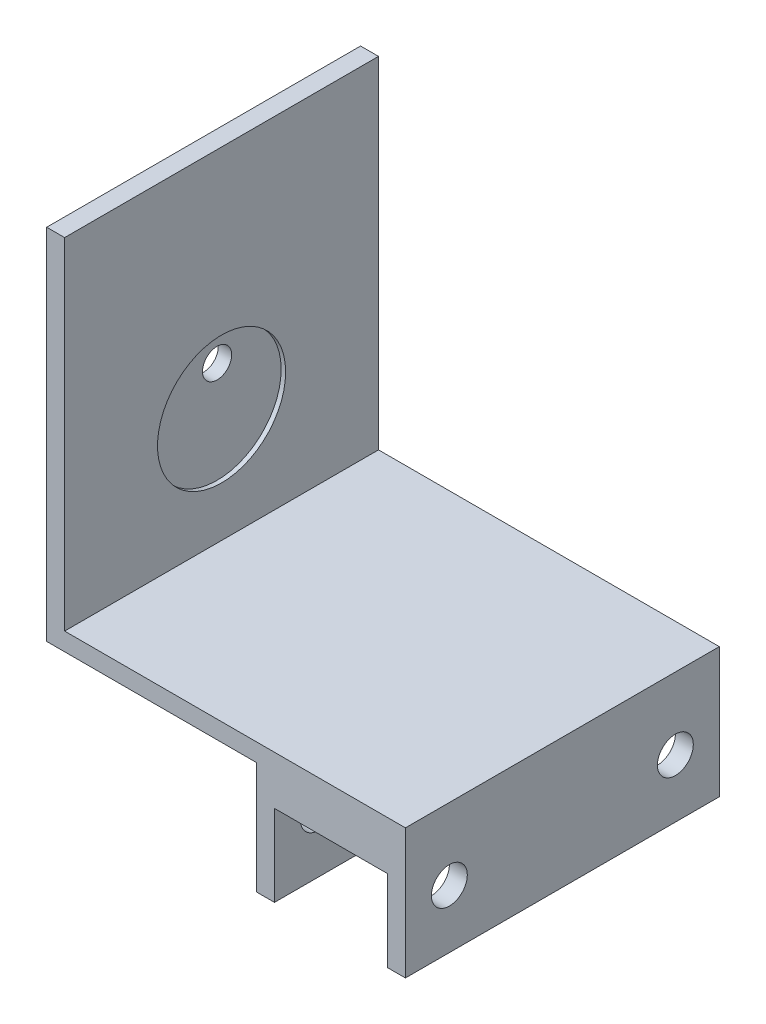
ISO-10303-21;
HEADER;
FILE_DESCRIPTION(('STEP AP214'),'2;1');
FILE_NAME('part.step','',(''),(''),'','','');
FILE_SCHEMA(('AUTOMOTIVE_DESIGN { 1 0 10303 214 1 1 1 1 }'));
ENDSEC;
DATA;
#1=APPLICATION_CONTEXT('core data for automotive mechanical design processes');
#2=APPLICATION_PROTOCOL_DEFINITION('international standard','automotive_design',2000,#1);
#3=PRODUCT_CONTEXT('',#1,'mechanical');
#4=PRODUCT('Part','Part','',(#3));
#5=PRODUCT_RELATED_PRODUCT_CATEGORY('part','',(#4));
#6=PRODUCT_DEFINITION_FORMATION('','',#4);
#7=PRODUCT_DEFINITION_CONTEXT('part definition',#1,'design');
#8=PRODUCT_DEFINITION('design','',#6,#7);
#9=PRODUCT_DEFINITION_SHAPE('','',#8);
#10=(LENGTH_UNIT() NAMED_UNIT(*) SI_UNIT(.MILLI.,.METRE.));
#11=(NAMED_UNIT(*) PLANE_ANGLE_UNIT() SI_UNIT($,.RADIAN.));
#12=(NAMED_UNIT(*) SI_UNIT($,.STERADIAN.) SOLID_ANGLE_UNIT());
#13=UNCERTAINTY_MEASURE_WITH_UNIT(LENGTH_MEASURE(1.E-05),#10,'distance_accuracy_value','');
#14=(GEOMETRIC_REPRESENTATION_CONTEXT(3) GLOBAL_UNCERTAINTY_ASSIGNED_CONTEXT((#13)) GLOBAL_UNIT_ASSIGNED_CONTEXT((#10,
#11,#12)) REPRESENTATION_CONTEXT('',''));
#15=CARTESIAN_POINT('',(0.,0.,0.));
#16=DIRECTION('',(0.,0.,1.));
#17=DIRECTION('',(1.,0.,0.));
#18=AXIS2_PLACEMENT_3D('',#15,#16,#17);
#19=CARTESIAN_POINT('',(76.,-25.,0.));
#20=DIRECTION('',(-1.,0.,0.));
#21=DIRECTION('',(0.,0.,1.));
#22=AXIS2_PLACEMENT_3D('',#19,#20,#21);
#23=PLANE('',#22);
#24=CARTESIAN_POINT('',(76.,-12.,-60.2));
#25=DIRECTION('',(-1.,0.,0.));
#26=DIRECTION('',(0.,0.,1.));
#27=AXIS2_PLACEMENT_3D('',#24,#25,#26);
#28=CIRCLE('',#27,4.00000000000001);
#29=CARTESIAN_POINT('',(76.,-12.,-56.2));
#30=VERTEX_POINT('',#29);
#31=EDGE_CURVE('E290',#30,#30,#28,.T.);
#32=ORIENTED_EDGE('',*,*,#31,.F.);
#33=EDGE_LOOP('',(#32));
#34=FACE_BOUND('',#33,.T.);
#35=CARTESIAN_POINT('',(76.,-12.,-9.8));
#36=DIRECTION('',(-1.,0.,0.));
#37=DIRECTION('',(0.,0.,1.));
#38=AXIS2_PLACEMENT_3D('',#35,#36,#37);
#39=CIRCLE('',#38,4.);
#40=CARTESIAN_POINT('',(76.,-12.,-5.8));
#41=VERTEX_POINT('',#40);
#42=EDGE_CURVE('E195',#41,#41,#39,.F.);
#43=ORIENTED_EDGE('',*,*,#42,.T.);
#44=EDGE_LOOP('',(#43));
#45=FACE_BOUND('',#44,.T.);
#46=DIRECTION('',(0.,1.,0.));
#47=VECTOR('',#46,1.);
#48=CARTESIAN_POINT('',(76.,-25.,0.));
#49=LINE('',#48,#47);
#50=CARTESIAN_POINT('',(76.,-25.,0.));
#51=VERTEX_POINT('',#50);
#52=CARTESIAN_POINT('',(76.,-6.84,0.));
#53=VERTEX_POINT('',#52);
#54=EDGE_CURVE('E83',#51,#53,#49,.T.);
#55=ORIENTED_EDGE('',*,*,#54,.T.);
#56=DIRECTION('',(0.,0.,1.));
#57=VECTOR('',#56,1.);
#58=CARTESIAN_POINT('',(76.,-6.84,0.));
#59=LINE('',#58,#57);
#60=CARTESIAN_POINT('',(76.,-6.84,-70.));
#61=VERTEX_POINT('',#60);
#62=EDGE_CURVE('E396',#61,#53,#59,.T.);
#63=ORIENTED_EDGE('',*,*,#62,.F.);
#64=DIRECTION('',(0.,1.,0.));
#65=VECTOR('',#64,1.);
#66=CARTESIAN_POINT('',(76.,-25.,-70.));
#67=LINE('',#66,#65);
#68=CARTESIAN_POINT('',(76.,-25.,-70.));
#69=VERTEX_POINT('',#68);
#70=EDGE_CURVE('E218',#69,#61,#67,.T.);
#71=ORIENTED_EDGE('',*,*,#70,.F.);
#72=DIRECTION('',(0.,0.,1.));
#73=VECTOR('',#72,1.);
#74=CARTESIAN_POINT('',(76.,-25.,0.));
#75=LINE('',#74,#73);
#76=EDGE_CURVE('E207',#69,#51,#75,.T.);
#77=ORIENTED_EDGE('',*,*,#76,.T.);
#78=EDGE_LOOP('',(#55,#63,#71,#77));
#79=FACE_BOUND('',#78,.T.);
#80=ADVANCED_FACE('F65',(#34,#45,#79),#23,.T.);
#81=CARTESIAN_POINT('',(50.8,-25.,0.));
#82=DIRECTION('',(-1.,0.,0.));
#83=DIRECTION('',(0.,0.,1.));
#84=AXIS2_PLACEMENT_3D('',#81,#82,#83);
#85=PLANE('',#84);
#86=CARTESIAN_POINT('',(50.8,-12.,-9.8));
#87=DIRECTION('',(-1.,0.,0.));
#88=DIRECTION('',(0.,0.,1.));
#89=AXIS2_PLACEMENT_3D('',#86,#87,#88);
#90=CIRCLE('',#89,4.);
#91=CARTESIAN_POINT('',(50.8,-12.,-5.8));
#92=VERTEX_POINT('',#91);
#93=EDGE_CURVE('E307',#92,#92,#90,.F.);
#94=ORIENTED_EDGE('',*,*,#93,.F.);
#95=EDGE_LOOP('',(#94));
#96=FACE_BOUND('',#95,.T.);
#97=CARTESIAN_POINT('',(50.8,-12.,-60.2));
#98=DIRECTION('',(-1.,0.,0.));
#99=DIRECTION('',(0.,0.,1.));
#100=AXIS2_PLACEMENT_3D('',#97,#98,#99);
#101=CIRCLE('',#100,4.00000000000001);
#102=CARTESIAN_POINT('',(50.8,-12.,-56.2));
#103=VERTEX_POINT('',#102);
#104=EDGE_CURVE('E283',#103,#103,#101,.T.);
#105=ORIENTED_EDGE('',*,*,#104,.T.);
#106=EDGE_LOOP('',(#105));
#107=FACE_BOUND('',#106,.T.);
#108=DIRECTION('',(0.,0.,1.));
#109=VECTOR('',#108,1.);
#110=CARTESIAN_POINT('',(50.8,-6.84,0.));
#111=LINE('',#110,#109);
#112=CARTESIAN_POINT('',(50.8,-6.84,-70.));
#113=VERTEX_POINT('',#112);
#114=CARTESIAN_POINT('',(50.8,-6.84,0.));
#115=VERTEX_POINT('',#114);
#116=EDGE_CURVE('E91',#113,#115,#111,.T.);
#117=ORIENTED_EDGE('',*,*,#116,.T.);
#118=DIRECTION('',(0.,1.,0.));
#119=VECTOR('',#118,1.);
#120=CARTESIAN_POINT('',(50.8,-25.,0.));
#121=LINE('',#120,#119);
#122=CARTESIAN_POINT('',(50.8,-25.,0.));
#123=VERTEX_POINT('',#122);
#124=EDGE_CURVE('E199',#123,#115,#121,.T.);
#125=ORIENTED_EDGE('',*,*,#124,.F.);
#126=DIRECTION('',(0.,0.,1.));
#127=VECTOR('',#126,1.);
#128=CARTESIAN_POINT('',(50.8,-25.,0.));
#129=LINE('',#128,#127);
#130=CARTESIAN_POINT('',(50.8,-25.,-70.));
#131=VERTEX_POINT('',#130);
#132=EDGE_CURVE('E170',#131,#123,#129,.T.);
#133=ORIENTED_EDGE('',*,*,#132,.F.);
#134=DIRECTION('',(0.,1.,0.));
#135=VECTOR('',#134,1.);
#136=CARTESIAN_POINT('',(50.8,-25.,-70.));
#137=LINE('',#136,#135);
#138=EDGE_CURVE('E177',#131,#113,#137,.T.);
#139=ORIENTED_EDGE('',*,*,#138,.T.);
#140=EDGE_LOOP('',(#117,#125,#133,#139));
#141=FACE_BOUND('',#140,.T.);
#142=ADVANCED_FACE('F336',(#96,#107,#141),#85,.F.);
#143=CARTESIAN_POINT('',(0.,37.756,-35.));
#144=DIRECTION('',(1.,0.,0.));
#145=DIRECTION('',(0.,0.,-1.));
#146=AXIS2_PLACEMENT_3D('',#143,#144,#145);
#147=CYLINDRICAL_SURFACE('',#146,3.25);
#148=CARTESIAN_POINT('',(0.,37.756,-35.));
#149=DIRECTION('',(1.,0.,0.));
#150=DIRECTION('',(0.,0.,-1.));
#151=AXIS2_PLACEMENT_3D('',#148,#149,#150);
#152=CIRCLE('',#151,3.25);
#153=CARTESIAN_POINT('',(0.,37.756,-38.25));
#154=VERTEX_POINT('',#153);
#155=EDGE_CURVE('E299',#154,#154,#152,.T.);
#156=ORIENTED_EDGE('',*,*,#155,.F.);
#157=EDGE_LOOP('',(#156));
#158=FACE_BOUND('',#157,.T.);
#159=CARTESIAN_POINT('',(3.,37.756,-35.));
#160=DIRECTION('',(1.,0.,0.));
#161=DIRECTION('',(0.,0.,-1.));
#162=AXIS2_PLACEMENT_3D('',#159,#160,#161);
#163=CIRCLE('',#162,3.25);
#164=CARTESIAN_POINT('',(3.,37.756,-38.25));
#165=VERTEX_POINT('',#164);
#166=EDGE_CURVE('E414',#165,#165,#163,.T.);
#167=ORIENTED_EDGE('',*,*,#166,.T.);
#168=EDGE_LOOP('',(#167));
#169=FACE_BOUND('',#168,.T.);
#170=ADVANCED_FACE('F342',(#158,#169),#147,.F.);
#171=CARTESIAN_POINT('',(80.,4.,0.));
#172=DIRECTION('',(-1.,0.,0.));
#173=DIRECTION('',(0.,0.,1.));
#174=AXIS2_PLACEMENT_3D('',#171,#172,#173);
#175=PLANE('',#174);
#176=CARTESIAN_POINT('',(80.,-12.,-60.2));
#177=DIRECTION('',(1.,0.,0.));
#178=DIRECTION('',(0.,0.,-1.));
#179=AXIS2_PLACEMENT_3D('',#176,#177,#178);
#180=CIRCLE('',#179,4.00000000000001);
#181=CARTESIAN_POINT('',(80.,-12.,-64.2));
#182=VERTEX_POINT('',#181);
#183=EDGE_CURVE('E293',#182,#182,#180,.T.);
#184=ORIENTED_EDGE('',*,*,#183,.F.);
#185=EDGE_LOOP('',(#184));
#186=FACE_BOUND('',#185,.T.);
#187=DIRECTION('',(0.,-1.,0.));
#188=VECTOR('',#187,1.);
#189=CARTESIAN_POINT('',(80.,4.,0.));
#190=LINE('',#189,#188);
#191=CARTESIAN_POINT('',(80.,4.,0.));
#192=VERTEX_POINT('',#191);
#193=CARTESIAN_POINT('',(80.,-25.,0.));
#194=VERTEX_POINT('',#193);
#195=EDGE_CURVE('E276',#192,#194,#190,.T.);
#196=ORIENTED_EDGE('',*,*,#195,.T.);
#197=DIRECTION('',(0.,0.,-1.));
#198=VECTOR('',#197,1.);
#199=CARTESIAN_POINT('',(80.,-25.,0.));
#200=LINE('',#199,#198);
#201=CARTESIAN_POINT('',(80.,-25.,-70.));
#202=VERTEX_POINT('',#201);
#203=EDGE_CURVE('E214',#194,#202,#200,.T.);
#204=ORIENTED_EDGE('',*,*,#203,.T.);
#205=DIRECTION('',(0.,-1.,0.));
#206=VECTOR('',#205,1.);
#207=CARTESIAN_POINT('',(80.,4.,-70.));
#208=LINE('',#207,#206);
#209=CARTESIAN_POINT('',(80.,4.,-70.));
#210=VERTEX_POINT('',#209);
#211=EDGE_CURVE('E265',#210,#202,#208,.T.);
#212=ORIENTED_EDGE('',*,*,#211,.F.);
#213=DIRECTION('',(0.,0.,-1.));
#214=VECTOR('',#213,1.);
#215=CARTESIAN_POINT('',(80.,4.,0.));
#216=LINE('',#215,#214);
#217=EDGE_CURVE('E261',#192,#210,#216,.T.);
#218=ORIENTED_EDGE('',*,*,#217,.F.);
#219=EDGE_LOOP('',(#196,#204,#212,#218));
#220=FACE_BOUND('',#219,.T.);
#221=CARTESIAN_POINT('',(80.,-12.,-9.8));
#222=DIRECTION('',(1.,0.,0.));
#223=DIRECTION('',(0.,0.,-1.));
#224=AXIS2_PLACEMENT_3D('',#221,#222,#223);
#225=CIRCLE('',#224,4.);
#226=CARTESIAN_POINT('',(80.,-12.,-13.8));
#227=VERTEX_POINT('',#226);
#228=EDGE_CURVE('E284',#227,#227,#225,.F.);
#229=ORIENTED_EDGE('',*,*,#228,.T.);
#230=EDGE_LOOP('',(#229));
#231=FACE_BOUND('',#230,.T.);
#232=ADVANCED_FACE('F67',(#186,#220,#231),#175,.F.);
#233=CARTESIAN_POINT('',(46.8,-25.,0.));
#234=DIRECTION('',(-1.,0.,0.));
#235=DIRECTION('',(0.,0.,1.));
#236=AXIS2_PLACEMENT_3D('',#233,#234,#235);
#237=PLANE('',#236);
#238=DIRECTION('',(0.,0.,1.));
#239=VECTOR('',#238,1.);
#240=CARTESIAN_POINT('',(46.8,0.,0.));
#241=LINE('',#240,#239);
#242=CARTESIAN_POINT('',(46.8,0.,-70.));
#243=VERTEX_POINT('',#242);
#244=CARTESIAN_POINT('',(46.8,0.,0.));
#245=VERTEX_POINT('',#244);
#246=EDGE_CURVE('E166',#243,#245,#241,.T.);
#247=ORIENTED_EDGE('',*,*,#246,.F.);
#248=DIRECTION('',(0.,1.,0.));
#249=VECTOR('',#248,1.);
#250=CARTESIAN_POINT('',(46.8,-25.,-70.));
#251=LINE('',#250,#249);
#252=CARTESIAN_POINT('',(46.8,-25.,-70.));
#253=VERTEX_POINT('',#252);
#254=EDGE_CURVE('E159',#253,#243,#251,.T.);
#255=ORIENTED_EDGE('',*,*,#254,.F.);
#256=DIRECTION('',(0.,0.,1.));
#257=VECTOR('',#256,1.);
#258=CARTESIAN_POINT('',(46.8,-25.,0.));
#259=LINE('',#258,#257);
#260=CARTESIAN_POINT('',(46.8,-25.,0.));
#261=VERTEX_POINT('',#260);
#262=EDGE_CURVE('E165',#253,#261,#259,.T.);
#263=ORIENTED_EDGE('',*,*,#262,.T.);
#264=DIRECTION('',(0.,1.,0.));
#265=VECTOR('',#264,1.);
#266=CARTESIAN_POINT('',(46.8,-25.,0.));
#267=LINE('',#266,#265);
#268=EDGE_CURVE('E169',#261,#245,#267,.T.);
#269=ORIENTED_EDGE('',*,*,#268,.T.);
#270=EDGE_LOOP('',(#247,#255,#263,#269));
#271=FACE_BOUND('',#270,.T.);
#272=CARTESIAN_POINT('',(46.8,-12.,-60.2));
#273=DIRECTION('',(-1.,0.,0.));
#274=DIRECTION('',(0.,0.,1.));
#275=AXIS2_PLACEMENT_3D('',#272,#273,#274);
#276=CIRCLE('',#275,4.00000000000001);
#277=CARTESIAN_POINT('',(46.8,-12.,-56.2));
#278=VERTEX_POINT('',#277);
#279=EDGE_CURVE('E280',#278,#278,#276,.T.);
#280=ORIENTED_EDGE('',*,*,#279,.F.);
#281=EDGE_LOOP('',(#280));
#282=FACE_BOUND('',#281,.T.);
#283=CARTESIAN_POINT('',(46.8,-12.,-9.8));
#284=DIRECTION('',(-1.,0.,0.));
#285=DIRECTION('',(0.,0.,1.));
#286=AXIS2_PLACEMENT_3D('',#283,#284,#285);
#287=CIRCLE('',#286,4.);
#288=CARTESIAN_POINT('',(46.8,-12.,-5.8));
#289=VERTEX_POINT('',#288);
#290=EDGE_CURVE('E69',#289,#289,#287,.F.);
#291=ORIENTED_EDGE('',*,*,#290,.T.);
#292=EDGE_LOOP('',(#291));
#293=FACE_BOUND('',#292,.T.);
#294=ADVANCED_FACE('F161',(#271,#282,#293),#237,.T.);
#295=CARTESIAN_POINT('',(0.,0.,0.));
#296=DIRECTION('',(0.,1.,0.));
#297=DIRECTION('',(0.,0.,1.));
#298=AXIS2_PLACEMENT_3D('',#295,#296,#297);
#299=PLANE('',#298);
#300=DIRECTION('',(1.,0.,0.));
#301=VECTOR('',#300,1.);
#302=CARTESIAN_POINT('',(0.,0.,-70.));
#303=LINE('',#302,#301);
#304=CARTESIAN_POINT('',(0.,0.,-70.));
#305=VERTEX_POINT('',#304);
#306=EDGE_CURVE('E254',#305,#243,#303,.T.);
#307=ORIENTED_EDGE('',*,*,#306,.T.);
#308=ORIENTED_EDGE('',*,*,#246,.T.);
#309=DIRECTION('',(1.,0.,0.));
#310=VECTOR('',#309,1.);
#311=CARTESIAN_POINT('',(0.,0.,0.));
#312=LINE('',#311,#310);
#313=CARTESIAN_POINT('',(0.,0.,0.));
#314=VERTEX_POINT('',#313);
#315=EDGE_CURVE('E251',#314,#245,#312,.T.);
#316=ORIENTED_EDGE('',*,*,#315,.F.);
#317=DIRECTION('',(0.,0.,-1.));
#318=VECTOR('',#317,1.);
#319=CARTESIAN_POINT('',(0.,0.,0.));
#320=LINE('',#319,#318);
#321=EDGE_CURVE('E247',#314,#305,#320,.T.);
#322=ORIENTED_EDGE('',*,*,#321,.T.);
#323=EDGE_LOOP('',(#307,#308,#316,#322));
#324=FACE_BOUND('',#323,.T.);
#325=ADVANCED_FACE('F363',(#324),#299,.F.);
#326=CARTESIAN_POINT('',(0.,4.,0.));
#327=DIRECTION('',(0.,0.,-1.));
#328=DIRECTION('',(-1.,0.,0.));
#329=AXIS2_PLACEMENT_3D('',#326,#327,#328);
#330=PLANE('',#329);
#331=DIRECTION('',(1.,0.,0.));
#332=VECTOR('',#331,1.);
#333=CARTESIAN_POINT('',(0.,4.,0.));
#334=LINE('',#333,#332);
#335=CARTESIAN_POINT('',(4.,4.,0.));
#336=VERTEX_POINT('',#335);
#337=EDGE_CURVE('E75',#336,#192,#334,.T.);
#338=ORIENTED_EDGE('',*,*,#337,.F.);
#339=DIRECTION('',(0.,-1.,0.));
#340=VECTOR('',#339,1.);
#341=CARTESIAN_POINT('',(4.00000000000001,80.,0.));
#342=LINE('',#341,#340);
#343=CARTESIAN_POINT('',(4.00000000000001,80.,0.));
#344=VERTEX_POINT('',#343);
#345=EDGE_CURVE('E243',#344,#336,#342,.T.);
#346=ORIENTED_EDGE('',*,*,#345,.F.);
#347=DIRECTION('',(1.,0.,0.));
#348=VECTOR('',#347,1.);
#349=CARTESIAN_POINT('',(0.,80.,0.));
#350=LINE('',#349,#348);
#351=CARTESIAN_POINT('',(0.,80.,0.));
#352=VERTEX_POINT('',#351);
#353=EDGE_CURVE('E232',#352,#344,#350,.T.);
#354=ORIENTED_EDGE('',*,*,#353,.F.);
#355=DIRECTION('',(0.,-1.,0.));
#356=VECTOR('',#355,1.);
#357=CARTESIAN_POINT('',(0.,4.,0.));
#358=LINE('',#357,#356);
#359=EDGE_CURVE('E272',#352,#314,#358,.T.);
#360=ORIENTED_EDGE('',*,*,#359,.T.);
#361=ORIENTED_EDGE('',*,*,#315,.T.);
#362=ORIENTED_EDGE('',*,*,#268,.F.);
#363=DIRECTION('',(1.,0.,0.));
#364=VECTOR('',#363,1.);
#365=CARTESIAN_POINT('',(0.,-25.,0.));
#366=LINE('',#365,#364);
#367=EDGE_CURVE('E184',#261,#123,#366,.T.);
#368=ORIENTED_EDGE('',*,*,#367,.T.);
#369=ORIENTED_EDGE('',*,*,#124,.T.);
#370=DIRECTION('',(1.,0.,0.));
#371=VECTOR('',#370,1.);
#372=CARTESIAN_POINT('',(0.,-6.84,0.));
#373=LINE('',#372,#371);
#374=EDGE_CURVE('E406',#115,#53,#373,.T.);
#375=ORIENTED_EDGE('',*,*,#374,.T.);
#376=ORIENTED_EDGE('',*,*,#54,.F.);
#377=DIRECTION('',(1.,0.,0.));
#378=VECTOR('',#377,1.);
#379=CARTESIAN_POINT('',(0.,-25.,0.));
#380=LINE('',#379,#378);
#381=EDGE_CURVE('E210',#51,#194,#380,.T.);
#382=ORIENTED_EDGE('',*,*,#381,.T.);
#383=ORIENTED_EDGE('',*,*,#195,.F.);
#384=EDGE_LOOP('',(#338,#346,#354,#360,#361,#362,#368,#369,#375,#376,#382,#383));
#385=FACE_BOUND('',#384,.T.);
#386=ADVANCED_FACE('F366',(#385),#330,.F.);
#387=CARTESIAN_POINT('',(0.,4.,-70.));
#388=DIRECTION('',(0.,0.,-1.));
#389=DIRECTION('',(-1.,0.,0.));
#390=AXIS2_PLACEMENT_3D('',#387,#388,#389);
#391=PLANE('',#390);
#392=ORIENTED_EDGE('',*,*,#211,.T.);
#393=DIRECTION('',(1.,0.,0.));
#394=VECTOR('',#393,1.);
#395=CARTESIAN_POINT('',(0.,-25.,-70.));
#396=LINE('',#395,#394);
#397=EDGE_CURVE('E198',#69,#202,#396,.T.);
#398=ORIENTED_EDGE('',*,*,#397,.F.);
#399=ORIENTED_EDGE('',*,*,#70,.T.);
#400=DIRECTION('',(1.,0.,0.));
#401=VECTOR('',#400,1.);
#402=CARTESIAN_POINT('',(0.,-6.84,-70.));
#403=LINE('',#402,#401);
#404=EDGE_CURVE('E398',#113,#61,#403,.T.);
#405=ORIENTED_EDGE('',*,*,#404,.F.);
#406=ORIENTED_EDGE('',*,*,#138,.F.);
#407=DIRECTION('',(1.,0.,0.));
#408=VECTOR('',#407,1.);
#409=CARTESIAN_POINT('',(0.,-25.,-70.));
#410=LINE('',#409,#408);
#411=EDGE_CURVE('E174',#253,#131,#410,.T.);
#412=ORIENTED_EDGE('',*,*,#411,.F.);
#413=ORIENTED_EDGE('',*,*,#254,.T.);
#414=ORIENTED_EDGE('',*,*,#306,.F.);
#415=DIRECTION('',(0.,-1.,0.));
#416=VECTOR('',#415,1.);
#417=CARTESIAN_POINT('',(0.,4.,-70.));
#418=LINE('',#417,#416);
#419=CARTESIAN_POINT('',(0.,80.,-70.));
#420=VERTEX_POINT('',#419);
#421=EDGE_CURVE('E257',#420,#305,#418,.T.);
#422=ORIENTED_EDGE('',*,*,#421,.F.);
#423=DIRECTION('',(1.,0.,0.));
#424=VECTOR('',#423,1.);
#425=CARTESIAN_POINT('',(0.,80.,-70.));
#426=LINE('',#425,#424);
#427=CARTESIAN_POINT('',(4.,80.,-70.));
#428=VERTEX_POINT('',#427);
#429=EDGE_CURVE('E221',#420,#428,#426,.T.);
#430=ORIENTED_EDGE('',*,*,#429,.T.);
#431=DIRECTION('',(0.,-1.,0.));
#432=VECTOR('',#431,1.);
#433=CARTESIAN_POINT('',(4.,80.,-70.));
#434=LINE('',#433,#432);
#435=CARTESIAN_POINT('',(4.,4.,-70.));
#436=VERTEX_POINT('',#435);
#437=EDGE_CURVE('E239',#428,#436,#434,.T.);
#438=ORIENTED_EDGE('',*,*,#437,.T.);
#439=DIRECTION('',(1.,0.,0.));
#440=VECTOR('',#439,1.);
#441=CARTESIAN_POINT('',(0.,4.,-70.));
#442=LINE('',#441,#440);
#443=EDGE_CURVE('E248',#436,#210,#442,.T.);
#444=ORIENTED_EDGE('',*,*,#443,.T.);
#445=EDGE_LOOP('',(#392,#398,#399,#405,#406,#412,#413,#414,#422,#430,#438,#444));
#446=FACE_BOUND('',#445,.T.);
#447=ADVANCED_FACE('F175',(#446),#391,.T.);
#448=CARTESIAN_POINT('',(0.,4.,0.));
#449=DIRECTION('',(0.,1.,0.));
#450=DIRECTION('',(0.,0.,1.));
#451=AXIS2_PLACEMENT_3D('',#448,#449,#450);
#452=PLANE('',#451);
#453=DIRECTION('',(0.,0.,-1.));
#454=VECTOR('',#453,1.);
#455=CARTESIAN_POINT('',(4.00000000000001,4.,0.));
#456=LINE('',#455,#454);
#457=EDGE_CURVE('E12',#336,#436,#456,.T.);
#458=ORIENTED_EDGE('',*,*,#457,.F.);
#459=ORIENTED_EDGE('',*,*,#337,.T.);
#460=ORIENTED_EDGE('',*,*,#217,.T.);
#461=ORIENTED_EDGE('',*,*,#443,.F.);
#462=EDGE_LOOP('',(#458,#459,#460,#461));
#463=FACE_BOUND('',#462,.T.);
#464=ADVANCED_FACE('F359',(#463),#452,.T.);
#465=CARTESIAN_POINT('',(0.,4.,0.));
#466=DIRECTION('',(-1.,0.,0.));
#467=DIRECTION('',(0.,0.,1.));
#468=AXIS2_PLACEMENT_3D('',#465,#466,#467);
#469=PLANE('',#468);
#470=ORIENTED_EDGE('',*,*,#155,.T.);
#471=EDGE_LOOP('',(#470));
#472=FACE_BOUND('',#471,.T.);
#473=ORIENTED_EDGE('',*,*,#321,.F.);
#474=ORIENTED_EDGE('',*,*,#359,.F.);
#475=DIRECTION('',(0.,0.,-1.));
#476=VECTOR('',#475,1.);
#477=CARTESIAN_POINT('',(0.,80.,0.));
#478=LINE('',#477,#476);
#479=EDGE_CURVE('E228',#352,#420,#478,.T.);
#480=ORIENTED_EDGE('',*,*,#479,.T.);
#481=ORIENTED_EDGE('',*,*,#421,.T.);
#482=EDGE_LOOP('',(#473,#474,#480,#481));
#483=FACE_BOUND('',#482,.T.);
#484=ADVANCED_FACE('F357',(#472,#483),#469,.T.);
#485=CARTESIAN_POINT('',(4.00000000000001,80.,0.));
#486=DIRECTION('',(1.,0.,0.));
#487=DIRECTION('',(0.,0.,-1.));
#488=AXIS2_PLACEMENT_3D('',#485,#486,#487);
#489=PLANE('',#488);
#490=CARTESIAN_POINT('',(4.,29.4,-35.));
#491=DIRECTION('',(1.,0.,0.));
#492=DIRECTION('',(0.,0.,-1.));
#493=AXIS2_PLACEMENT_3D('',#490,#491,#492);
#494=CIRCLE('',#493,14.2875);
#495=CARTESIAN_POINT('',(4.,29.4,-49.2875));
#496=VERTEX_POINT('',#495);
#497=EDGE_CURVE('E413',#496,#496,#494,.T.);
#498=ORIENTED_EDGE('',*,*,#497,.F.);
#499=EDGE_LOOP('',(#498));
#500=FACE_BOUND('',#499,.T.);
#501=ORIENTED_EDGE('',*,*,#345,.T.);
#502=ORIENTED_EDGE('',*,*,#457,.T.);
#503=ORIENTED_EDGE('',*,*,#437,.F.);
#504=DIRECTION('',(0.,0.,1.));
#505=VECTOR('',#504,1.);
#506=CARTESIAN_POINT('',(4.00000000000001,80.,0.));
#507=LINE('',#506,#505);
#508=EDGE_CURVE('E235',#428,#344,#507,.T.);
#509=ORIENTED_EDGE('',*,*,#508,.T.);
#510=EDGE_LOOP('',(#501,#502,#503,#509));
#511=FACE_BOUND('',#510,.T.);
#512=ADVANCED_FACE('F353',(#500,#511),#489,.T.);
#513=CARTESIAN_POINT('',(0.,80.,0.));
#514=DIRECTION('',(0.,1.,0.));
#515=DIRECTION('',(0.,0.,1.));
#516=AXIS2_PLACEMENT_3D('',#513,#514,#515);
#517=PLANE('',#516);
#518=ORIENTED_EDGE('',*,*,#429,.F.);
#519=ORIENTED_EDGE('',*,*,#479,.F.);
#520=ORIENTED_EDGE('',*,*,#353,.T.);
#521=ORIENTED_EDGE('',*,*,#508,.F.);
#522=EDGE_LOOP('',(#518,#519,#520,#521));
#523=FACE_BOUND('',#522,.T.);
#524=ADVANCED_FACE('F350',(#523),#517,.T.);
#525=CARTESIAN_POINT('',(0.,-25.,0.));
#526=DIRECTION('',(0.,1.,0.));
#527=DIRECTION('',(0.,0.,1.));
#528=AXIS2_PLACEMENT_3D('',#525,#526,#527);
#529=PLANE('',#528);
#530=ORIENTED_EDGE('',*,*,#397,.T.);
#531=ORIENTED_EDGE('',*,*,#203,.F.);
#532=ORIENTED_EDGE('',*,*,#381,.F.);
#533=ORIENTED_EDGE('',*,*,#76,.F.);
#534=EDGE_LOOP('',(#530,#531,#532,#533));
#535=FACE_BOUND('',#534,.T.);
#536=ADVANCED_FACE('F348',(#535),#529,.F.);
#537=CARTESIAN_POINT('',(0.,-25.,0.));
#538=DIRECTION('',(0.,1.,0.));
#539=DIRECTION('',(0.,0.,1.));
#540=AXIS2_PLACEMENT_3D('',#537,#538,#539);
#541=PLANE('',#540);
#542=ORIENTED_EDGE('',*,*,#411,.T.);
#543=ORIENTED_EDGE('',*,*,#132,.T.);
#544=ORIENTED_EDGE('',*,*,#367,.F.);
#545=ORIENTED_EDGE('',*,*,#262,.F.);
#546=EDGE_LOOP('',(#542,#543,#544,#545));
#547=FACE_BOUND('',#546,.T.);
#548=ADVANCED_FACE('F182',(#547),#541,.F.);
#549=CARTESIAN_POINT('',(0.,-12.,-60.2));
#550=DIRECTION('',(1.,0.,0.));
#551=DIRECTION('',(0.,0.,-1.));
#552=AXIS2_PLACEMENT_3D('',#549,#550,#551);
#553=CYLINDRICAL_SURFACE('',#552,4.00000000000001);
#554=ORIENTED_EDGE('',*,*,#279,.T.);
#555=EDGE_LOOP('',(#554));
#556=FACE_BOUND('',#555,.T.);
#557=ORIENTED_EDGE('',*,*,#104,.F.);
#558=EDGE_LOOP('',(#557));
#559=FACE_BOUND('',#558,.T.);
#560=ADVANCED_FACE('F331',(#556,#559),#553,.F.);
#561=CARTESIAN_POINT('',(0.,-12.,-9.8));
#562=DIRECTION('',(1.,0.,0.));
#563=DIRECTION('',(0.,0.,-1.));
#564=AXIS2_PLACEMENT_3D('',#561,#562,#563);
#565=CYLINDRICAL_SURFACE('',#564,4.);
#566=ORIENTED_EDGE('',*,*,#290,.F.);
#567=EDGE_LOOP('',(#566));
#568=FACE_BOUND('',#567,.T.);
#569=ORIENTED_EDGE('',*,*,#93,.T.);
#570=EDGE_LOOP('',(#569));
#571=FACE_BOUND('',#570,.T.);
#572=ADVANCED_FACE('F321',(#568,#571),#565,.F.);
#573=ORIENTED_EDGE('',*,*,#31,.T.);
#574=EDGE_LOOP('',(#573));
#575=FACE_BOUND('',#574,.T.);
#576=ORIENTED_EDGE('',*,*,#183,.T.);
#577=EDGE_LOOP('',(#576));
#578=FACE_BOUND('',#577,.T.);
#579=ADVANCED_FACE('F319',(#575,#578),#553,.F.);
#580=ORIENTED_EDGE('',*,*,#42,.F.);
#581=EDGE_LOOP('',(#580));
#582=FACE_BOUND('',#581,.T.);
#583=ORIENTED_EDGE('',*,*,#228,.F.);
#584=EDGE_LOOP('',(#583));
#585=FACE_BOUND('',#584,.T.);
#586=ADVANCED_FACE('F315',(#582,#585),#565,.F.);
#587=CARTESIAN_POINT('',(3.,29.4,-35.));
#588=DIRECTION('',(1.,0.,0.));
#589=DIRECTION('',(0.,0.,-1.));
#590=AXIS2_PLACEMENT_3D('',#587,#588,#589);
#591=CYLINDRICAL_SURFACE('',#590,14.2875);
#592=CARTESIAN_POINT('',(3.,29.4,-35.));
#593=DIRECTION('',(1.,0.,0.));
#594=DIRECTION('',(0.,0.,-1.));
#595=AXIS2_PLACEMENT_3D('',#592,#593,#594);
#596=CIRCLE('',#595,14.2875);
#597=CARTESIAN_POINT('',(3.,29.4,-49.2875));
#598=VERTEX_POINT('',#597);
#599=EDGE_CURVE('E418',#598,#598,#596,.T.);
#600=ORIENTED_EDGE('',*,*,#599,.F.);
#601=EDGE_LOOP('',(#600));
#602=FACE_BOUND('',#601,.T.);
#603=ORIENTED_EDGE('',*,*,#497,.T.);
#604=EDGE_LOOP('',(#603));
#605=FACE_BOUND('',#604,.T.);
#606=ADVANCED_FACE('F318',(#602,#605),#591,.F.);
#607=CARTESIAN_POINT('',(3.00000000000001,0.,0.));
#608=DIRECTION('',(1.,0.,0.));
#609=DIRECTION('',(0.,0.,-1.));
#610=AXIS2_PLACEMENT_3D('',#607,#608,#609);
#611=PLANE('',#610);
#612=ORIENTED_EDGE('',*,*,#166,.F.);
#613=EDGE_LOOP('',(#612));
#614=FACE_BOUND('',#613,.T.);
#615=ORIENTED_EDGE('',*,*,#599,.T.);
#616=EDGE_LOOP('',(#615));
#617=FACE_BOUND('',#616,.T.);
#618=ADVANCED_FACE('F326',(#614,#617),#611,.T.);
#619=CARTESIAN_POINT('',(0.,-6.84,0.));
#620=DIRECTION('',(0.,1.,0.));
#621=DIRECTION('',(0.,0.,1.));
#622=AXIS2_PLACEMENT_3D('',#619,#620,#621);
#623=PLANE('',#622);
#624=ORIENTED_EDGE('',*,*,#404,.T.);
#625=ORIENTED_EDGE('',*,*,#62,.T.);
#626=ORIENTED_EDGE('',*,*,#374,.F.);
#627=ORIENTED_EDGE('',*,*,#116,.F.);
#628=EDGE_LOOP('',(#624,#625,#626,#627));
#629=FACE_BOUND('',#628,.T.);
#630=ADVANCED_FACE('F400',(#629),#623,.F.);
#631=CLOSED_SHELL('',(#80,#142,#170,#232,#294,#325,#386,#447,#464,#484,#512,#524,#536,#548,#560,
#572,#579,#586,#606,#618,#630));
#632=MANIFOLD_SOLID_BREP('B2',#631);
#633=ADVANCED_BREP_SHAPE_REPRESENTATION('',(#18,#632),#14);
#634=SHAPE_DEFINITION_REPRESENTATION(#9,#633);
ENDSEC;
END-ISO-10303-21;
